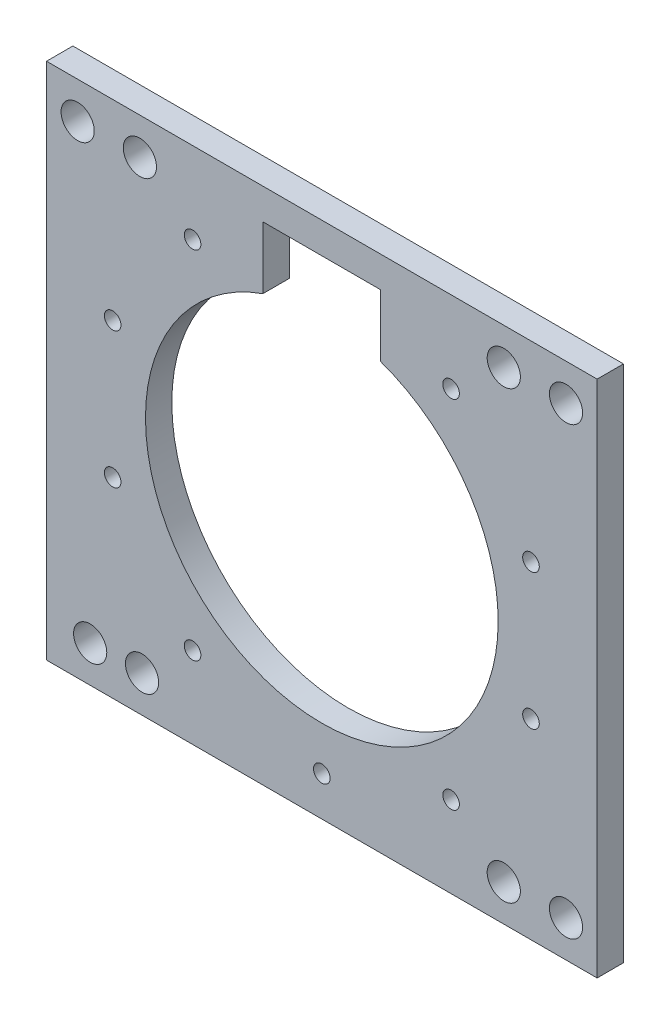
ISO-10303-21;
HEADER;
FILE_DESCRIPTION(('STEP AP214'),'2;1');
FILE_NAME('part.step','',(''),(''),'','','');
FILE_SCHEMA(('AUTOMOTIVE_DESIGN { 1 0 10303 214 1 1 1 1 }'));
ENDSEC;
DATA;
#1=APPLICATION_CONTEXT('core data for automotive mechanical design processes');
#2=APPLICATION_PROTOCOL_DEFINITION('international standard','automotive_design',2000,#1);
#3=PRODUCT_CONTEXT('',#1,'mechanical');
#4=PRODUCT('Part','Part','',(#3));
#5=PRODUCT_RELATED_PRODUCT_CATEGORY('part','',(#4));
#6=PRODUCT_DEFINITION_FORMATION('','',#4);
#7=PRODUCT_DEFINITION_CONTEXT('part definition',#1,'design');
#8=PRODUCT_DEFINITION('design','',#6,#7);
#9=PRODUCT_DEFINITION_SHAPE('','',#8);
#10=(LENGTH_UNIT() NAMED_UNIT(*) SI_UNIT(.MILLI.,.METRE.));
#11=(NAMED_UNIT(*) PLANE_ANGLE_UNIT() SI_UNIT($,.RADIAN.));
#12=(NAMED_UNIT(*) SI_UNIT($,.STERADIAN.) SOLID_ANGLE_UNIT());
#13=UNCERTAINTY_MEASURE_WITH_UNIT(LENGTH_MEASURE(1.E-05),#10,'distance_accuracy_value','');
#14=(GEOMETRIC_REPRESENTATION_CONTEXT(3) GLOBAL_UNCERTAINTY_ASSIGNED_CONTEXT((#13)) GLOBAL_UNIT_ASSIGNED_CONTEXT((#10,
#11,#12)) REPRESENTATION_CONTEXT('',''));
#15=CARTESIAN_POINT('',(0.,0.,0.));
#16=DIRECTION('',(0.,0.,1.));
#17=DIRECTION('',(1.,0.,0.));
#18=AXIS2_PLACEMENT_3D('',#15,#16,#17);
#19=CARTESIAN_POINT('',(0.,0.,6.35));
#20=DIRECTION('',(0.,0.,-1.));
#21=DIRECTION('',(-1.,0.,0.));
#22=AXIS2_PLACEMENT_3D('',#19,#20,#21);
#23=PLANE('',#22);
#24=CARTESIAN_POINT('',(-58.9257107133858,53.3846571464963,6.35));
#25=DIRECTION('',(0.,0.,1.));
#26=DIRECTION('',(1.,0.,0.));
#27=AXIS2_PLACEMENT_3D('',#24,#25,#26);
#28=CIRCLE('',#27,3.99999999999999);
#29=CARTESIAN_POINT('',(-54.9257107133858,53.3846571464963,6.35));
#30=VERTEX_POINT('',#29);
#31=EDGE_CURVE('E306',#30,#30,#28,.T.);
#32=ORIENTED_EDGE('',*,*,#31,.F.);
#33=EDGE_LOOP('',(#32));
#34=FACE_BOUND('',#33,.T.);
#35=CARTESIAN_POINT('',(-43.4033213928974,-53.9903428534907,6.35));
#36=DIRECTION('',(0.,0.,1.));
#37=DIRECTION('',(1.,0.,0.));
#38=AXIS2_PLACEMENT_3D('',#35,#36,#37);
#39=CIRCLE('',#38,3.99999999999999);
#40=CARTESIAN_POINT('',(-39.4033213928974,-53.9903428534907,6.35));
#41=VERTEX_POINT('',#40);
#42=EDGE_CURVE('E301',#41,#41,#39,.T.);
#43=ORIENTED_EDGE('',*,*,#42,.F.);
#44=EDGE_LOOP('',(#43));
#45=FACE_BOUND('',#44,.T.);
#46=CARTESIAN_POINT('',(-55.9033213928974,-53.9903428534907,6.35));
#47=DIRECTION('',(0.,0.,1.));
#48=DIRECTION('',(1.,0.,0.));
#49=AXIS2_PLACEMENT_3D('',#46,#47,#48);
#50=CIRCLE('',#49,3.99999999999999);
#51=CARTESIAN_POINT('',(-51.9033213928974,-53.9903428534907,6.35));
#52=VERTEX_POINT('',#51);
#53=EDGE_CURVE('E294',#52,#52,#50,.T.);
#54=ORIENTED_EDGE('',*,*,#53,.F.);
#55=EDGE_LOOP('',(#54));
#56=FACE_BOUND('',#55,.T.);
#57=CARTESIAN_POINT('',(43.7742892866382,-53.9903428535038,6.35));
#58=DIRECTION('',(0.,0.,1.));
#59=DIRECTION('',(1.,0.,0.));
#60=AXIS2_PLACEMENT_3D('',#57,#58,#59);
#61=CIRCLE('',#60,4.00000000000002);
#62=CARTESIAN_POINT('',(47.7742892866383,-53.9903428535038,6.35));
#63=VERTEX_POINT('',#62);
#64=EDGE_CURVE('E293',#63,#63,#61,.T.);
#65=ORIENTED_EDGE('',*,*,#64,.F.);
#66=EDGE_LOOP('',(#65));
#67=FACE_BOUND('',#66,.T.);
#68=CARTESIAN_POINT('',(-43.9257107133857,53.3846571464963,6.35));
#69=DIRECTION('',(0.,0.,1.));
#70=DIRECTION('',(1.,0.,0.));
#71=AXIS2_PLACEMENT_3D('',#68,#69,#70);
#72=CIRCLE('',#71,3.99999999999999);
#73=CARTESIAN_POINT('',(-39.9257107133858,53.3846571464963,6.35));
#74=VERTEX_POINT('',#73);
#75=EDGE_CURVE('E313',#74,#74,#72,.T.);
#76=ORIENTED_EDGE('',*,*,#75,.F.);
#77=EDGE_LOOP('',(#76));
#78=FACE_BOUND('',#77,.T.);
#79=CARTESIAN_POINT('',(43.7742892866405,53.3846571465095,6.35));
#80=DIRECTION('',(0.,0.,1.));
#81=DIRECTION('',(1.,0.,0.));
#82=AXIS2_PLACEMENT_3D('',#79,#80,#81);
#83=CIRCLE('',#82,3.99999999999999);
#84=CARTESIAN_POINT('',(47.7742892866405,53.3846571465095,6.35));
#85=VERTEX_POINT('',#84);
#86=EDGE_CURVE('E325',#85,#85,#83,.T.);
#87=ORIENTED_EDGE('',*,*,#86,.F.);
#88=EDGE_LOOP('',(#87));
#89=FACE_BOUND('',#88,.T.);
#90=CARTESIAN_POINT('',(58.7742892866405,53.3846571465095,6.35));
#91=DIRECTION('',(0.,0.,1.));
#92=DIRECTION('',(1.,0.,0.));
#93=AXIS2_PLACEMENT_3D('',#90,#91,#92);
#94=CIRCLE('',#93,3.99999999999999);
#95=CARTESIAN_POINT('',(62.7742892866405,53.3846571465095,6.35));
#96=VERTEX_POINT('',#95);
#97=EDGE_CURVE('E318',#96,#96,#94,.T.);
#98=ORIENTED_EDGE('',*,*,#97,.F.);
#99=EDGE_LOOP('',(#98));
#100=FACE_BOUND('',#99,.T.);
#101=CARTESIAN_POINT('',(58.7742892866383,-53.9903428535038,6.35));
#102=DIRECTION('',(0.,0.,1.));
#103=DIRECTION('',(1.,0.,0.));
#104=AXIS2_PLACEMENT_3D('',#101,#102,#103);
#105=CIRCLE('',#104,3.99999999999999);
#106=CARTESIAN_POINT('',(62.7742892866382,-53.9903428535038,6.35));
#107=VERTEX_POINT('',#106);
#108=EDGE_CURVE('E290',#107,#107,#105,.T.);
#109=ORIENTED_EDGE('',*,*,#108,.F.);
#110=EDGE_LOOP('',(#109));
#111=FACE_BOUND('',#110,.T.);
#112=DIRECTION('',(0.,1.,0.));
#113=VECTOR('',#112,1.);
#114=CARTESIAN_POINT('',(66.2742892866405,-62.8028428534907,6.35));
#115=LINE('',#114,#113);
#116=CARTESIAN_POINT('',(66.2742892866405,-62.8028428534907,6.35));
#117=VERTEX_POINT('',#116);
#118=CARTESIAN_POINT('',(66.2742892866405,62.1971571465094,6.35));
#119=VERTEX_POINT('',#118);
#120=EDGE_CURVE('E140',#117,#119,#115,.T.);
#121=ORIENTED_EDGE('',*,*,#120,.T.);
#122=DIRECTION('',(-1.,0.,0.));
#123=VECTOR('',#122,1.);
#124=CARTESIAN_POINT('',(-66.4257107133857,62.1971571465094,6.35));
#125=LINE('',#124,#123);
#126=CARTESIAN_POINT('',(-66.4257107133857,62.1971571465094,6.35));
#127=VERTEX_POINT('',#126);
#128=EDGE_CURVE('E143',#119,#127,#125,.T.);
#129=ORIENTED_EDGE('',*,*,#128,.T.);
#130=DIRECTION('',(0.,-1.,0.));
#131=VECTOR('',#130,1.);
#132=CARTESIAN_POINT('',(-66.4257107133857,-62.8028428534907,6.35));
#133=LINE('',#132,#131);
#134=CARTESIAN_POINT('',(-66.4257107133857,-62.8028428534907,6.35));
#135=VERTEX_POINT('',#134);
#136=EDGE_CURVE('E146',#127,#135,#133,.T.);
#137=ORIENTED_EDGE('',*,*,#136,.T.);
#138=DIRECTION('',(1.,0.,0.));
#139=VECTOR('',#138,1.);
#140=CARTESIAN_POINT('',(-66.4257107133857,-62.8028428534907,6.35));
#141=LINE('',#140,#139);
#142=EDGE_CURVE('E148',#135,#117,#141,.T.);
#143=ORIENTED_EDGE('',*,*,#142,.T.);
#144=EDGE_LOOP('',(#121,#129,#137,#143));
#145=FACE_BOUND('',#144,.T.);
#146=CARTESIAN_POINT('',(-0.0757107133809026,-0.302842853497107,6.34999999999999));
#147=DIRECTION('',(0.,0.,-1.));
#148=DIRECTION('',(-1.,0.,0.));
#149=AXIS2_PLACEMENT_3D('',#146,#147,#148);
#150=CIRCLE('',#149,42.5);
#151=CARTESIAN_POINT('',(14.1242892866191,39.7547406981851,6.35));
#152=VERTEX_POINT('',#151);
#153=CARTESIAN_POINT('',(-14.2757107133809,39.7547406981851,6.34999999999999));
#154=VERTEX_POINT('',#153);
#155=EDGE_CURVE('E136',#152,#154,#150,.T.);
#156=ORIENTED_EDGE('',*,*,#155,.T.);
#157=DIRECTION('',(0.,1.,0.));
#158=VECTOR('',#157,1.);
#159=CARTESIAN_POINT('',(-14.2757107133809,39.7547406981851,6.34999999999999));
#160=LINE('',#159,#158);
#161=CARTESIAN_POINT('',(-14.2757107133809,54.7547406981851,6.34999999999999));
#162=VERTEX_POINT('',#161);
#163=EDGE_CURVE('E139',#154,#162,#160,.T.);
#164=ORIENTED_EDGE('',*,*,#163,.T.);
#165=DIRECTION('',(1.,0.,0.));
#166=VECTOR('',#165,1.);
#167=CARTESIAN_POINT('',(-14.2757107133809,54.7547406981851,6.34999999999999));
#168=LINE('',#167,#166);
#169=CARTESIAN_POINT('',(14.1242892866191,54.7547406981851,6.34999999999999));
#170=VERTEX_POINT('',#169);
#171=EDGE_CURVE('E108',#162,#170,#168,.T.);
#172=ORIENTED_EDGE('',*,*,#171,.T.);
#173=DIRECTION('',(0.,-1.,0.));
#174=VECTOR('',#173,1.);
#175=CARTESIAN_POINT('',(14.1242892866191,54.7547406981851,6.34999999999999));
#176=LINE('',#175,#174);
#177=EDGE_CURVE('E155',#170,#152,#176,.T.);
#178=ORIENTED_EDGE('',*,*,#177,.T.);
#179=EDGE_LOOP('',(#156,#164,#172,#178));
#180=FACE_BOUND('',#179,.T.);
#181=CARTESIAN_POINT('',(-31.228329084882,42.5750578483751,6.34999999999999));
#182=DIRECTION('',(0.,0.,-1.));
#183=DIRECTION('',(-1.,0.,0.));
#184=AXIS2_PLACEMENT_3D('',#181,#182,#183);
#185=CIRCLE('',#184,2.00000000000008);
#186=CARTESIAN_POINT('',(-33.2283290848821,42.5750578483751,6.34999999999999));
#187=VERTEX_POINT('',#186);
#188=EDGE_CURVE('E284',#187,#187,#185,.T.);
#189=ORIENTED_EDGE('',*,*,#188,.T.);
#190=EDGE_LOOP('',(#189));
#191=FACE_BOUND('',#190,.T.);
#192=CARTESIAN_POINT('',(31.0769076581202,42.5750578483751,6.34999999999999));
#193=DIRECTION('',(0.,0.,-1.));
#194=DIRECTION('',(-1.,0.,0.));
#195=AXIS2_PLACEMENT_3D('',#192,#193,#194);
#196=CIRCLE('',#195,2.00000000000068);
#197=CARTESIAN_POINT('',(29.0769076581195,42.5750578483751,6.34999999999999));
#198=VERTEX_POINT('',#197);
#199=EDGE_CURVE('E238',#198,#198,#196,.T.);
#200=ORIENTED_EDGE('',*,*,#199,.T.);
#201=EDGE_LOOP('',(#200));
#202=FACE_BOUND('',#201,.T.);
#203=CARTESIAN_POINT('',(50.3302846502623,16.0750578483751,6.34999999999999));
#204=DIRECTION('',(0.,0.,-1.));
#205=DIRECTION('',(-1.,0.,0.));
#206=AXIS2_PLACEMENT_3D('',#203,#204,#205);
#207=CIRCLE('',#206,2.0000000000006);
#208=CARTESIAN_POINT('',(48.3302846502616,16.0750578483751,6.34999999999999));
#209=VERTEX_POINT('',#208);
#210=EDGE_CURVE('E237',#209,#209,#207,.T.);
#211=ORIENTED_EDGE('',*,*,#210,.T.);
#212=EDGE_LOOP('',(#211));
#213=FACE_BOUND('',#212,.T.);
#214=CARTESIAN_POINT('',(50.3302846502623,-16.6807435553693,6.34999999999999));
#215=DIRECTION('',(0.,0.,-1.));
#216=DIRECTION('',(-1.,0.,0.));
#217=AXIS2_PLACEMENT_3D('',#214,#215,#216);
#218=CIRCLE('',#217,2.00000000000049);
#219=CARTESIAN_POINT('',(48.3302846502618,-16.6807435553693,6.34999999999999));
#220=VERTEX_POINT('',#219);
#221=EDGE_CURVE('E245',#220,#220,#218,.T.);
#222=ORIENTED_EDGE('',*,*,#221,.T.);
#223=EDGE_LOOP('',(#222));
#224=FACE_BOUND('',#223,.T.);
#225=CARTESIAN_POINT('',(31.0769076581202,-43.1807435553694,6.34999999999999));
#226=DIRECTION('',(0.,0.,-1.));
#227=DIRECTION('',(-1.,0.,0.));
#228=AXIS2_PLACEMENT_3D('',#225,#226,#227);
#229=CIRCLE('',#228,2.00000000000045);
#230=CARTESIAN_POINT('',(29.0769076581197,-43.1807435553694,6.34999999999999));
#231=VERTEX_POINT('',#230);
#232=EDGE_CURVE('E251',#231,#231,#229,.T.);
#233=ORIENTED_EDGE('',*,*,#232,.T.);
#234=EDGE_LOOP('',(#233));
#235=FACE_BOUND('',#234,.T.);
#236=CARTESIAN_POINT('',(-0.0757107133809061,-53.3028428534971,6.34999999999999));
#237=DIRECTION('',(0.,0.,-1.));
#238=DIRECTION('',(-1.,0.,0.));
#239=AXIS2_PLACEMENT_3D('',#236,#237,#238);
#240=CIRCLE('',#239,2.00000000000036);
#241=CARTESIAN_POINT('',(-2.07571071338126,-53.3028428534971,6.34999999999999));
#242=VERTEX_POINT('',#241);
#243=EDGE_CURVE('E257',#242,#242,#240,.T.);
#244=ORIENTED_EDGE('',*,*,#243,.T.);
#245=EDGE_LOOP('',(#244));
#246=FACE_BOUND('',#245,.T.);
#247=CARTESIAN_POINT('',(-31.228329084882,-43.1807435553693,6.34999999999999));
#248=DIRECTION('',(0.,0.,-1.));
#249=DIRECTION('',(-1.,0.,0.));
#250=AXIS2_PLACEMENT_3D('',#247,#248,#249);
#251=CIRCLE('',#250,2.00000000000028);
#252=CARTESIAN_POINT('',(-33.2283290848823,-43.1807435553693,6.34999999999999));
#253=VERTEX_POINT('',#252);
#254=EDGE_CURVE('E263',#253,#253,#251,.T.);
#255=ORIENTED_EDGE('',*,*,#254,.T.);
#256=EDGE_LOOP('',(#255));
#257=FACE_BOUND('',#256,.T.);
#258=CARTESIAN_POINT('',(-50.4817060770241,-16.6807435553693,6.34999999999999));
#259=DIRECTION('',(0.,0.,-1.));
#260=DIRECTION('',(-1.,0.,0.));
#261=AXIS2_PLACEMENT_3D('',#258,#259,#260);
#262=CIRCLE('',#261,2.00000000000021);
#263=CARTESIAN_POINT('',(-52.4817060770243,-16.6807435553693,6.34999999999999));
#264=VERTEX_POINT('',#263);
#265=EDGE_CURVE('E269',#264,#264,#262,.T.);
#266=ORIENTED_EDGE('',*,*,#265,.T.);
#267=EDGE_LOOP('',(#266));
#268=FACE_BOUND('',#267,.T.);
#269=CARTESIAN_POINT('',(-50.4817060770241,16.0750578483751,6.34999999999999));
#270=DIRECTION('',(0.,0.,-1.));
#271=DIRECTION('',(-1.,0.,0.));
#272=AXIS2_PLACEMENT_3D('',#269,#270,#271);
#273=CIRCLE('',#272,2.00000000000015);
#274=CARTESIAN_POINT('',(-52.4817060770242,16.0750578483751,6.34999999999999));
#275=VERTEX_POINT('',#274);
#276=EDGE_CURVE('E275',#275,#275,#273,.T.);
#277=ORIENTED_EDGE('',*,*,#276,.T.);
#278=EDGE_LOOP('',(#277));
#279=FACE_BOUND('',#278,.T.);
#280=ADVANCED_FACE('F40',(#34,#45,#56,#67,#78,#89,#100,#111,#145,#180,#191,#202,#213,#224,#235,
#246,#257,#268,#279),#23,.F.);
#281=CARTESIAN_POINT('',(0.,0.,0.));
#282=DIRECTION('',(0.,0.,-1.));
#283=DIRECTION('',(-1.,0.,0.));
#284=AXIS2_PLACEMENT_3D('',#281,#282,#283);
#285=PLANE('',#284);
#286=CARTESIAN_POINT('',(-58.9257107133858,53.3846571464963,0.));
#287=DIRECTION('',(0.,0.,-1.));
#288=DIRECTION('',(-1.,0.,0.));
#289=AXIS2_PLACEMENT_3D('',#286,#287,#288);
#290=CIRCLE('',#289,3.99999999999999);
#291=CARTESIAN_POINT('',(-62.9257107133857,53.3846571464963,0.));
#292=VERTEX_POINT('',#291);
#293=EDGE_CURVE('E310',#292,#292,#290,.F.);
#294=ORIENTED_EDGE('',*,*,#293,.T.);
#295=EDGE_LOOP('',(#294));
#296=FACE_BOUND('',#295,.T.);
#297=CARTESIAN_POINT('',(-43.4033213928974,-53.9903428534907,0.));
#298=DIRECTION('',(0.,0.,-1.));
#299=DIRECTION('',(-1.,0.,0.));
#300=AXIS2_PLACEMENT_3D('',#297,#298,#299);
#301=CIRCLE('',#300,3.99999999999999);
#302=CARTESIAN_POINT('',(-47.4033213928974,-53.9903428534907,0.));
#303=VERTEX_POINT('',#302);
#304=EDGE_CURVE('E309',#303,#303,#301,.F.);
#305=ORIENTED_EDGE('',*,*,#304,.T.);
#306=EDGE_LOOP('',(#305));
#307=FACE_BOUND('',#306,.T.);
#308=CARTESIAN_POINT('',(-55.9033213928974,-53.9903428534907,0.));
#309=DIRECTION('',(0.,0.,-1.));
#310=DIRECTION('',(-1.,0.,0.));
#311=AXIS2_PLACEMENT_3D('',#308,#309,#310);
#312=CIRCLE('',#311,3.99999999999999);
#313=CARTESIAN_POINT('',(-59.9033213928974,-53.9903428534907,0.));
#314=VERTEX_POINT('',#313);
#315=EDGE_CURVE('E298',#314,#314,#312,.F.);
#316=ORIENTED_EDGE('',*,*,#315,.T.);
#317=EDGE_LOOP('',(#316));
#318=FACE_BOUND('',#317,.T.);
#319=CARTESIAN_POINT('',(43.7742892866382,-53.9903428535038,0.));
#320=DIRECTION('',(0.,0.,-1.));
#321=DIRECTION('',(-1.,0.,0.));
#322=AXIS2_PLACEMENT_3D('',#319,#320,#321);
#323=CIRCLE('',#322,4.00000000000002);
#324=CARTESIAN_POINT('',(39.7742892866382,-53.9903428535038,0.));
#325=VERTEX_POINT('',#324);
#326=EDGE_CURVE('E297',#325,#325,#323,.F.);
#327=ORIENTED_EDGE('',*,*,#326,.T.);
#328=EDGE_LOOP('',(#327));
#329=FACE_BOUND('',#328,.T.);
#330=CARTESIAN_POINT('',(-43.9257107133857,53.3846571464963,0.));
#331=DIRECTION('',(0.,0.,-1.));
#332=DIRECTION('',(-1.,0.,0.));
#333=AXIS2_PLACEMENT_3D('',#330,#331,#332);
#334=CIRCLE('',#333,3.99999999999999);
#335=CARTESIAN_POINT('',(-47.9257107133857,53.3846571464963,0.));
#336=VERTEX_POINT('',#335);
#337=EDGE_CURVE('E328',#336,#336,#334,.F.);
#338=ORIENTED_EDGE('',*,*,#337,.T.);
#339=EDGE_LOOP('',(#338));
#340=FACE_BOUND('',#339,.T.);
#341=CARTESIAN_POINT('',(43.7742892866405,53.3846571465095,0.));
#342=DIRECTION('',(0.,0.,-1.));
#343=DIRECTION('',(-1.,0.,0.));
#344=AXIS2_PLACEMENT_3D('',#341,#342,#343);
#345=CIRCLE('',#344,3.99999999999999);
#346=CARTESIAN_POINT('',(39.7742892866405,53.3846571465095,0.));
#347=VERTEX_POINT('',#346);
#348=EDGE_CURVE('E321',#347,#347,#345,.F.);
#349=ORIENTED_EDGE('',*,*,#348,.T.);
#350=EDGE_LOOP('',(#349));
#351=FACE_BOUND('',#350,.T.);
#352=CARTESIAN_POINT('',(58.7742892866405,53.3846571465095,0.));
#353=DIRECTION('',(0.,0.,-1.));
#354=DIRECTION('',(-1.,0.,0.));
#355=AXIS2_PLACEMENT_3D('',#352,#353,#354);
#356=CIRCLE('',#355,3.99999999999999);
#357=CARTESIAN_POINT('',(54.7742892866405,53.3846571465095,0.));
#358=VERTEX_POINT('',#357);
#359=EDGE_CURVE('E322',#358,#358,#356,.F.);
#360=ORIENTED_EDGE('',*,*,#359,.T.);
#361=EDGE_LOOP('',(#360));
#362=FACE_BOUND('',#361,.T.);
#363=CARTESIAN_POINT('',(58.7742892866383,-53.9903428535038,0.));
#364=DIRECTION('',(0.,0.,-1.));
#365=DIRECTION('',(-1.,0.,0.));
#366=AXIS2_PLACEMENT_3D('',#363,#364,#365);
#367=CIRCLE('',#366,3.99999999999999);
#368=CARTESIAN_POINT('',(54.7742892866383,-53.9903428535038,0.));
#369=VERTEX_POINT('',#368);
#370=EDGE_CURVE('E287',#369,#369,#367,.F.);
#371=ORIENTED_EDGE('',*,*,#370,.T.);
#372=EDGE_LOOP('',(#371));
#373=FACE_BOUND('',#372,.T.);
#374=CARTESIAN_POINT('',(-50.4817060770241,-16.6807435553693,0.));
#375=DIRECTION('',(0.,0.,1.));
#376=DIRECTION('',(1.,0.,0.));
#377=AXIS2_PLACEMENT_3D('',#374,#375,#376);
#378=CIRCLE('',#377,2.00000000000021);
#379=CARTESIAN_POINT('',(-48.4817060770238,-16.6807435553693,0.));
#380=VERTEX_POINT('',#379);
#381=EDGE_CURVE('E272',#380,#380,#378,.T.);
#382=ORIENTED_EDGE('',*,*,#381,.T.);
#383=EDGE_LOOP('',(#382));
#384=FACE_BOUND('',#383,.T.);
#385=CARTESIAN_POINT('',(-0.0757107133809061,-53.3028428534971,0.));
#386=DIRECTION('',(0.,0.,1.));
#387=DIRECTION('',(1.,0.,0.));
#388=AXIS2_PLACEMENT_3D('',#385,#386,#387);
#389=CIRCLE('',#388,2.00000000000036);
#390=CARTESIAN_POINT('',(1.92428928661945,-53.3028428534971,0.));
#391=VERTEX_POINT('',#390);
#392=EDGE_CURVE('E260',#391,#391,#389,.T.);
#393=ORIENTED_EDGE('',*,*,#392,.T.);
#394=EDGE_LOOP('',(#393));
#395=FACE_BOUND('',#394,.T.);
#396=CARTESIAN_POINT('',(50.3302846502623,-16.6807435553693,0.));
#397=DIRECTION('',(0.,0.,1.));
#398=DIRECTION('',(1.,0.,0.));
#399=AXIS2_PLACEMENT_3D('',#396,#397,#398);
#400=CIRCLE('',#399,2.00000000000049);
#401=CARTESIAN_POINT('',(52.3302846502627,-16.6807435553693,0.));
#402=VERTEX_POINT('',#401);
#403=EDGE_CURVE('E248',#402,#402,#400,.T.);
#404=ORIENTED_EDGE('',*,*,#403,.T.);
#405=EDGE_LOOP('',(#404));
#406=FACE_BOUND('',#405,.T.);
#407=CARTESIAN_POINT('',(31.0769076581202,42.5750578483751,0.));
#408=DIRECTION('',(0.,0.,1.));
#409=DIRECTION('',(1.,0.,0.));
#410=AXIS2_PLACEMENT_3D('',#407,#408,#409);
#411=CIRCLE('',#410,2.00000000000068);
#412=CARTESIAN_POINT('',(33.0769076581209,42.5750578483751,0.));
#413=VERTEX_POINT('',#412);
#414=EDGE_CURVE('E234',#413,#413,#411,.T.);
#415=ORIENTED_EDGE('',*,*,#414,.T.);
#416=EDGE_LOOP('',(#415));
#417=FACE_BOUND('',#416,.T.);
#418=DIRECTION('',(0.,-1.,0.));
#419=VECTOR('',#418,1.);
#420=CARTESIAN_POINT('',(-14.2757107133809,39.7547406981851,0.));
#421=LINE('',#420,#419);
#422=CARTESIAN_POINT('',(-14.2757107133809,54.7547406981851,0.));
#423=VERTEX_POINT('',#422);
#424=CARTESIAN_POINT('',(-14.2757107133809,39.7547406981851,0.));
#425=VERTEX_POINT('',#424);
#426=EDGE_CURVE('E115',#423,#425,#421,.T.);
#427=ORIENTED_EDGE('',*,*,#426,.T.);
#428=CARTESIAN_POINT('',(-0.0757107133809026,-0.302842853497107,0.));
#429=DIRECTION('',(0.,0.,1.));
#430=DIRECTION('',(1.,0.,0.));
#431=AXIS2_PLACEMENT_3D('',#428,#429,#430);
#432=CIRCLE('',#431,42.5);
#433=CARTESIAN_POINT('',(14.1242892866191,39.7547406981851,0.));
#434=VERTEX_POINT('',#433);
#435=EDGE_CURVE('E121',#425,#434,#432,.T.);
#436=ORIENTED_EDGE('',*,*,#435,.T.);
#437=DIRECTION('',(0.,1.,0.));
#438=VECTOR('',#437,1.);
#439=CARTESIAN_POINT('',(14.1242892866191,54.7547406981851,0.));
#440=LINE('',#439,#438);
#441=CARTESIAN_POINT('',(14.1242892866191,54.7547406981851,0.));
#442=VERTEX_POINT('',#441);
#443=EDGE_CURVE('E126',#434,#442,#440,.T.);
#444=ORIENTED_EDGE('',*,*,#443,.T.);
#445=DIRECTION('',(-1.,0.,0.));
#446=VECTOR('',#445,1.);
#447=CARTESIAN_POINT('',(-14.2757107133809,54.7547406981851,0.));
#448=LINE('',#447,#446);
#449=EDGE_CURVE('E63',#442,#423,#448,.T.);
#450=ORIENTED_EDGE('',*,*,#449,.T.);
#451=EDGE_LOOP('',(#427,#436,#444,#450));
#452=FACE_BOUND('',#451,.T.);
#453=DIRECTION('',(0.,1.,0.));
#454=VECTOR('',#453,1.);
#455=CARTESIAN_POINT('',(66.2742892866405,-62.8028428534907,0.));
#456=LINE('',#455,#454);
#457=CARTESIAN_POINT('',(66.2742892866405,-62.8028428534907,0.));
#458=VERTEX_POINT('',#457);
#459=CARTESIAN_POINT('',(66.2742892866405,62.1971571465094,0.));
#460=VERTEX_POINT('',#459);
#461=EDGE_CURVE('E151',#458,#460,#456,.T.);
#462=ORIENTED_EDGE('',*,*,#461,.F.);
#463=DIRECTION('',(1.,0.,0.));
#464=VECTOR('',#463,1.);
#465=CARTESIAN_POINT('',(-66.4257107133857,-62.8028428534907,0.));
#466=LINE('',#465,#464);
#467=CARTESIAN_POINT('',(-66.4257107133857,-62.8028428534907,0.));
#468=VERTEX_POINT('',#467);
#469=EDGE_CURVE('E144',#468,#458,#466,.T.);
#470=ORIENTED_EDGE('',*,*,#469,.F.);
#471=DIRECTION('',(0.,-1.,0.));
#472=VECTOR('',#471,1.);
#473=CARTESIAN_POINT('',(-66.4257107133857,-62.8028428534907,0.));
#474=LINE('',#473,#472);
#475=CARTESIAN_POINT('',(-66.4257107133857,62.1971571465094,0.));
#476=VERTEX_POINT('',#475);
#477=EDGE_CURVE('E157',#476,#468,#474,.T.);
#478=ORIENTED_EDGE('',*,*,#477,.F.);
#479=DIRECTION('',(-1.,0.,0.));
#480=VECTOR('',#479,1.);
#481=CARTESIAN_POINT('',(-66.4257107133857,62.1971571465094,0.));
#482=LINE('',#481,#480);
#483=EDGE_CURVE('E154',#460,#476,#482,.T.);
#484=ORIENTED_EDGE('',*,*,#483,.F.);
#485=EDGE_LOOP('',(#462,#470,#478,#484));
#486=FACE_BOUND('',#485,.T.);
#487=CARTESIAN_POINT('',(-31.228329084882,42.5750578483751,0.));
#488=DIRECTION('',(0.,0.,1.));
#489=DIRECTION('',(1.,0.,0.));
#490=AXIS2_PLACEMENT_3D('',#487,#488,#489);
#491=CIRCLE('',#490,2.00000000000008);
#492=CARTESIAN_POINT('',(-29.2283290848819,42.5750578483751,0.));
#493=VERTEX_POINT('',#492);
#494=EDGE_CURVE('E241',#493,#493,#491,.T.);
#495=ORIENTED_EDGE('',*,*,#494,.T.);
#496=EDGE_LOOP('',(#495));
#497=FACE_BOUND('',#496,.T.);
#498=CARTESIAN_POINT('',(50.3302846502623,16.0750578483751,0.));
#499=DIRECTION('',(0.,0.,1.));
#500=DIRECTION('',(1.,0.,0.));
#501=AXIS2_PLACEMENT_3D('',#498,#499,#500);
#502=CIRCLE('',#501,2.0000000000006);
#503=CARTESIAN_POINT('',(52.3302846502629,16.0750578483751,0.));
#504=VERTEX_POINT('',#503);
#505=EDGE_CURVE('E242',#504,#504,#502,.T.);
#506=ORIENTED_EDGE('',*,*,#505,.T.);
#507=EDGE_LOOP('',(#506));
#508=FACE_BOUND('',#507,.T.);
#509=CARTESIAN_POINT('',(31.0769076581202,-43.1807435553694,0.));
#510=DIRECTION('',(0.,0.,1.));
#511=DIRECTION('',(1.,0.,0.));
#512=AXIS2_PLACEMENT_3D('',#509,#510,#511);
#513=CIRCLE('',#512,2.00000000000045);
#514=CARTESIAN_POINT('',(33.0769076581206,-43.1807435553694,0.));
#515=VERTEX_POINT('',#514);
#516=EDGE_CURVE('E254',#515,#515,#513,.T.);
#517=ORIENTED_EDGE('',*,*,#516,.T.);
#518=EDGE_LOOP('',(#517));
#519=FACE_BOUND('',#518,.T.);
#520=CARTESIAN_POINT('',(-31.228329084882,-43.1807435553693,0.));
#521=DIRECTION('',(0.,0.,1.));
#522=DIRECTION('',(1.,0.,0.));
#523=AXIS2_PLACEMENT_3D('',#520,#521,#522);
#524=CIRCLE('',#523,2.00000000000028);
#525=CARTESIAN_POINT('',(-29.2283290848817,-43.1807435553693,0.));
#526=VERTEX_POINT('',#525);
#527=EDGE_CURVE('E266',#526,#526,#524,.T.);
#528=ORIENTED_EDGE('',*,*,#527,.T.);
#529=EDGE_LOOP('',(#528));
#530=FACE_BOUND('',#529,.T.);
#531=CARTESIAN_POINT('',(-50.4817060770241,16.0750578483751,0.));
#532=DIRECTION('',(0.,0.,1.));
#533=DIRECTION('',(1.,0.,0.));
#534=AXIS2_PLACEMENT_3D('',#531,#532,#533);
#535=CIRCLE('',#534,2.00000000000015);
#536=CARTESIAN_POINT('',(-48.4817060770239,16.0750578483751,0.));
#537=VERTEX_POINT('',#536);
#538=EDGE_CURVE('E128',#537,#537,#535,.T.);
#539=ORIENTED_EDGE('',*,*,#538,.T.);
#540=EDGE_LOOP('',(#539));
#541=FACE_BOUND('',#540,.T.);
#542=ADVANCED_FACE('F124',(#296,#307,#318,#329,#340,#351,#362,#373,#384,#395,#406,#417,#452,
#486,#497,#508,#519,#530,#541),#285,.T.);
#543=CARTESIAN_POINT('',(66.2742892866405,-62.8028428534907,6.35));
#544=DIRECTION('',(-1.,0.,0.));
#545=DIRECTION('',(0.,0.,1.));
#546=AXIS2_PLACEMENT_3D('',#543,#544,#545);
#547=PLANE('',#546);
#548=ORIENTED_EDGE('',*,*,#461,.T.);
#549=DIRECTION('',(0.,0.,-1.));
#550=VECTOR('',#549,1.);
#551=CARTESIAN_POINT('',(66.2742892866405,62.1971571465094,6.35));
#552=LINE('',#551,#550);
#553=EDGE_CURVE('E11',#119,#460,#552,.T.);
#554=ORIENTED_EDGE('',*,*,#553,.F.);
#555=ORIENTED_EDGE('',*,*,#120,.F.);
#556=DIRECTION('',(0.,0.,-1.));
#557=VECTOR('',#556,1.);
#558=CARTESIAN_POINT('',(66.2742892866405,-62.8028428534907,6.35));
#559=LINE('',#558,#557);
#560=EDGE_CURVE('E150',#117,#458,#559,.T.);
#561=ORIENTED_EDGE('',*,*,#560,.T.);
#562=EDGE_LOOP('',(#548,#554,#555,#561));
#563=FACE_BOUND('',#562,.T.);
#564=ADVANCED_FACE('F42',(#563),#547,.F.);
#565=CARTESIAN_POINT('',(-66.4257107133857,62.1971571465094,6.35));
#566=DIRECTION('',(0.,-1.,0.));
#567=DIRECTION('',(1.,0.,0.));
#568=AXIS2_PLACEMENT_3D('',#565,#566,#567);
#569=PLANE('',#568);
#570=ORIENTED_EDGE('',*,*,#483,.T.);
#571=DIRECTION('',(0.,0.,-1.));
#572=VECTOR('',#571,1.);
#573=CARTESIAN_POINT('',(-66.4257107133857,62.1971571465094,6.35));
#574=LINE('',#573,#572);
#575=EDGE_CURVE('E48',#127,#476,#574,.T.);
#576=ORIENTED_EDGE('',*,*,#575,.F.);
#577=ORIENTED_EDGE('',*,*,#128,.F.);
#578=ORIENTED_EDGE('',*,*,#553,.T.);
#579=EDGE_LOOP('',(#570,#576,#577,#578));
#580=FACE_BOUND('',#579,.T.);
#581=ADVANCED_FACE('F184',(#580),#569,.F.);
#582=CARTESIAN_POINT('',(-66.4257107133857,-62.8028428534907,6.35));
#583=DIRECTION('',(1.,0.,0.));
#584=DIRECTION('',(0.,0.,-1.));
#585=AXIS2_PLACEMENT_3D('',#582,#583,#584);
#586=PLANE('',#585);
#587=ORIENTED_EDGE('',*,*,#477,.T.);
#588=DIRECTION('',(0.,0.,-1.));
#589=VECTOR('',#588,1.);
#590=CARTESIAN_POINT('',(-66.4257107133857,-62.8028428534907,6.35));
#591=LINE('',#590,#589);
#592=EDGE_CURVE('E162',#135,#468,#591,.T.);
#593=ORIENTED_EDGE('',*,*,#592,.F.);
#594=ORIENTED_EDGE('',*,*,#136,.F.);
#595=ORIENTED_EDGE('',*,*,#575,.T.);
#596=EDGE_LOOP('',(#587,#593,#594,#595));
#597=FACE_BOUND('',#596,.T.);
#598=ADVANCED_FACE('F169',(#597),#586,.F.);
#599=CARTESIAN_POINT('',(-66.4257107133857,-62.8028428534907,6.35));
#600=DIRECTION('',(0.,1.,0.));
#601=DIRECTION('',(0.,0.,1.));
#602=AXIS2_PLACEMENT_3D('',#599,#600,#601);
#603=PLANE('',#602);
#604=ORIENTED_EDGE('',*,*,#469,.T.);
#605=ORIENTED_EDGE('',*,*,#560,.F.);
#606=ORIENTED_EDGE('',*,*,#142,.F.);
#607=ORIENTED_EDGE('',*,*,#592,.T.);
#608=EDGE_LOOP('',(#604,#605,#606,#607));
#609=FACE_BOUND('',#608,.T.);
#610=ADVANCED_FACE('F177',(#609),#603,.F.);
#611=CARTESIAN_POINT('',(-0.0757107133809026,-0.302842853497107,135.742743646788));
#612=DIRECTION('',(0.,0.,-1.));
#613=DIRECTION('',(-1.,0.,0.));
#614=AXIS2_PLACEMENT_3D('',#611,#612,#613);
#615=CYLINDRICAL_SURFACE('',#614,42.5);
#616=DIRECTION('',(0.,0.,-1.));
#617=VECTOR('',#616,1.);
#618=CARTESIAN_POINT('',(14.1242892866191,39.7547406981851,135.742743646788));
#619=LINE('',#618,#617);
#620=EDGE_CURVE('E55',#152,#434,#619,.T.);
#621=ORIENTED_EDGE('',*,*,#620,.T.);
#622=ORIENTED_EDGE('',*,*,#435,.F.);
#623=DIRECTION('',(0.,0.,-1.));
#624=VECTOR('',#623,1.);
#625=CARTESIAN_POINT('',(-14.2757107133809,39.7547406981851,135.742743646788));
#626=LINE('',#625,#624);
#627=EDGE_CURVE('E112',#154,#425,#626,.T.);
#628=ORIENTED_EDGE('',*,*,#627,.F.);
#629=ORIENTED_EDGE('',*,*,#155,.F.);
#630=EDGE_LOOP('',(#621,#622,#628,#629));
#631=FACE_BOUND('',#630,.T.);
#632=ADVANCED_FACE('F206',(#631),#615,.F.);
#633=CARTESIAN_POINT('',(-14.2757107133809,39.7547406981851,135.742743646788));
#634=DIRECTION('',(1.,0.,0.));
#635=DIRECTION('',(0.,0.,-1.));
#636=AXIS2_PLACEMENT_3D('',#633,#634,#635);
#637=PLANE('',#636);
#638=ORIENTED_EDGE('',*,*,#627,.T.);
#639=ORIENTED_EDGE('',*,*,#426,.F.);
#640=DIRECTION('',(0.,0.,-1.));
#641=VECTOR('',#640,1.);
#642=CARTESIAN_POINT('',(-14.2757107133809,54.7547406981851,135.742743646788));
#643=LINE('',#642,#641);
#644=EDGE_CURVE('E104',#162,#423,#643,.T.);
#645=ORIENTED_EDGE('',*,*,#644,.F.);
#646=ORIENTED_EDGE('',*,*,#163,.F.);
#647=EDGE_LOOP('',(#638,#639,#645,#646));
#648=FACE_BOUND('',#647,.T.);
#649=ADVANCED_FACE('F116',(#648),#637,.T.);
#650=CARTESIAN_POINT('',(-14.2757107133809,54.7547406981851,135.742743646788));
#651=DIRECTION('',(0.,-1.,0.));
#652=DIRECTION('',(0.,0.,-1.));
#653=AXIS2_PLACEMENT_3D('',#650,#651,#652);
#654=PLANE('',#653);
#655=ORIENTED_EDGE('',*,*,#644,.T.);
#656=ORIENTED_EDGE('',*,*,#449,.F.);
#657=DIRECTION('',(0.,0.,-1.));
#658=VECTOR('',#657,1.);
#659=CARTESIAN_POINT('',(14.1242892866191,54.7547406981851,135.742743646788));
#660=LINE('',#659,#658);
#661=EDGE_CURVE('E111',#170,#442,#660,.T.);
#662=ORIENTED_EDGE('',*,*,#661,.F.);
#663=ORIENTED_EDGE('',*,*,#171,.F.);
#664=EDGE_LOOP('',(#655,#656,#662,#663));
#665=FACE_BOUND('',#664,.T.);
#666=ADVANCED_FACE('F106',(#665),#654,.T.);
#667=CARTESIAN_POINT('',(14.1242892866191,54.7547406981851,135.742743646788));
#668=DIRECTION('',(-1.,0.,0.));
#669=DIRECTION('',(0.,0.,1.));
#670=AXIS2_PLACEMENT_3D('',#667,#668,#669);
#671=PLANE('',#670);
#672=ORIENTED_EDGE('',*,*,#661,.T.);
#673=ORIENTED_EDGE('',*,*,#443,.F.);
#674=ORIENTED_EDGE('',*,*,#620,.F.);
#675=ORIENTED_EDGE('',*,*,#177,.F.);
#676=EDGE_LOOP('',(#672,#673,#674,#675));
#677=FACE_BOUND('',#676,.T.);
#678=ADVANCED_FACE('F202',(#677),#671,.T.);
#679=CARTESIAN_POINT('',(-31.228329084882,42.5750578483751,135.742743646788));
#680=DIRECTION('',(0.,0.,-1.));
#681=DIRECTION('',(-1.,0.,0.));
#682=AXIS2_PLACEMENT_3D('',#679,#680,#681);
#683=CYLINDRICAL_SURFACE('',#682,2.00000000000008);
#684=ORIENTED_EDGE('',*,*,#188,.F.);
#685=EDGE_LOOP('',(#684));
#686=FACE_BOUND('',#685,.T.);
#687=ORIENTED_EDGE('',*,*,#494,.F.);
#688=EDGE_LOOP('',(#687));
#689=FACE_BOUND('',#688,.T.);
#690=ADVANCED_FACE('F223',(#686,#689),#683,.F.);
#691=CARTESIAN_POINT('',(31.0769076581202,42.5750578483751,135.742743646788));
#692=DIRECTION('',(0.,0.,-1.));
#693=DIRECTION('',(-1.,0.,0.));
#694=AXIS2_PLACEMENT_3D('',#691,#692,#693);
#695=CYLINDRICAL_SURFACE('',#694,2.00000000000068);
#696=ORIENTED_EDGE('',*,*,#199,.F.);
#697=EDGE_LOOP('',(#696));
#698=FACE_BOUND('',#697,.T.);
#699=ORIENTED_EDGE('',*,*,#414,.F.);
#700=EDGE_LOOP('',(#699));
#701=FACE_BOUND('',#700,.T.);
#702=ADVANCED_FACE('F217',(#698,#701),#695,.F.);
#703=CARTESIAN_POINT('',(50.3302846502623,16.0750578483751,135.742743646788));
#704=DIRECTION('',(0.,0.,-1.));
#705=DIRECTION('',(-1.,0.,0.));
#706=AXIS2_PLACEMENT_3D('',#703,#704,#705);
#707=CYLINDRICAL_SURFACE('',#706,2.0000000000006);
#708=ORIENTED_EDGE('',*,*,#210,.F.);
#709=EDGE_LOOP('',(#708));
#710=FACE_BOUND('',#709,.T.);
#711=ORIENTED_EDGE('',*,*,#505,.F.);
#712=EDGE_LOOP('',(#711));
#713=FACE_BOUND('',#712,.T.);
#714=ADVANCED_FACE('F395',(#710,#713),#707,.F.);
#715=CARTESIAN_POINT('',(50.3302846502623,-16.6807435553693,135.742743646788));
#716=DIRECTION('',(0.,0.,-1.));
#717=DIRECTION('',(-1.,0.,0.));
#718=AXIS2_PLACEMENT_3D('',#715,#716,#717);
#719=CYLINDRICAL_SURFACE('',#718,2.00000000000049);
#720=ORIENTED_EDGE('',*,*,#221,.F.);
#721=EDGE_LOOP('',(#720));
#722=FACE_BOUND('',#721,.T.);
#723=ORIENTED_EDGE('',*,*,#403,.F.);
#724=EDGE_LOOP('',(#723));
#725=FACE_BOUND('',#724,.T.);
#726=ADVANCED_FACE('F392',(#722,#725),#719,.F.);
#727=CARTESIAN_POINT('',(31.0769076581202,-43.1807435553694,135.742743646788));
#728=DIRECTION('',(0.,0.,-1.));
#729=DIRECTION('',(-1.,0.,0.));
#730=AXIS2_PLACEMENT_3D('',#727,#728,#729);
#731=CYLINDRICAL_SURFACE('',#730,2.00000000000045);
#732=ORIENTED_EDGE('',*,*,#232,.F.);
#733=EDGE_LOOP('',(#732));
#734=FACE_BOUND('',#733,.T.);
#735=ORIENTED_EDGE('',*,*,#516,.F.);
#736=EDGE_LOOP('',(#735));
#737=FACE_BOUND('',#736,.T.);
#738=ADVANCED_FACE('F388',(#734,#737),#731,.F.);
#739=CARTESIAN_POINT('',(-0.0757107133809061,-53.3028428534971,135.742743646788));
#740=DIRECTION('',(0.,0.,-1.));
#741=DIRECTION('',(-1.,0.,0.));
#742=AXIS2_PLACEMENT_3D('',#739,#740,#741);
#743=CYLINDRICAL_SURFACE('',#742,2.00000000000036);
#744=ORIENTED_EDGE('',*,*,#243,.F.);
#745=EDGE_LOOP('',(#744));
#746=FACE_BOUND('',#745,.T.);
#747=ORIENTED_EDGE('',*,*,#392,.F.);
#748=EDGE_LOOP('',(#747));
#749=FACE_BOUND('',#748,.T.);
#750=ADVANCED_FACE('F384',(#746,#749),#743,.F.);
#751=CARTESIAN_POINT('',(-31.228329084882,-43.1807435553693,135.742743646788));
#752=DIRECTION('',(0.,0.,-1.));
#753=DIRECTION('',(-1.,0.,0.));
#754=AXIS2_PLACEMENT_3D('',#751,#752,#753);
#755=CYLINDRICAL_SURFACE('',#754,2.00000000000028);
#756=ORIENTED_EDGE('',*,*,#254,.F.);
#757=EDGE_LOOP('',(#756));
#758=FACE_BOUND('',#757,.T.);
#759=ORIENTED_EDGE('',*,*,#527,.F.);
#760=EDGE_LOOP('',(#759));
#761=FACE_BOUND('',#760,.T.);
#762=ADVANCED_FACE('F380',(#758,#761),#755,.F.);
#763=CARTESIAN_POINT('',(-50.4817060770241,-16.6807435553693,135.742743646788));
#764=DIRECTION('',(0.,0.,-1.));
#765=DIRECTION('',(-1.,0.,0.));
#766=AXIS2_PLACEMENT_3D('',#763,#764,#765);
#767=CYLINDRICAL_SURFACE('',#766,2.00000000000021);
#768=ORIENTED_EDGE('',*,*,#265,.F.);
#769=EDGE_LOOP('',(#768));
#770=FACE_BOUND('',#769,.T.);
#771=ORIENTED_EDGE('',*,*,#381,.F.);
#772=EDGE_LOOP('',(#771));
#773=FACE_BOUND('',#772,.T.);
#774=ADVANCED_FACE('F376',(#770,#773),#767,.F.);
#775=CARTESIAN_POINT('',(-50.4817060770241,16.0750578483751,135.742743646788));
#776=DIRECTION('',(0.,0.,-1.));
#777=DIRECTION('',(-1.,0.,0.));
#778=AXIS2_PLACEMENT_3D('',#775,#776,#777);
#779=CYLINDRICAL_SURFACE('',#778,2.00000000000015);
#780=ORIENTED_EDGE('',*,*,#276,.F.);
#781=EDGE_LOOP('',(#780));
#782=FACE_BOUND('',#781,.T.);
#783=ORIENTED_EDGE('',*,*,#538,.F.);
#784=EDGE_LOOP('',(#783));
#785=FACE_BOUND('',#784,.T.);
#786=ADVANCED_FACE('F371',(#782,#785),#779,.F.);
#787=CARTESIAN_POINT('',(58.7742892866383,-53.9903428535038,-11.3137084989848));
#788=DIRECTION('',(0.,0.,1.));
#789=DIRECTION('',(1.,0.,0.));
#790=AXIS2_PLACEMENT_3D('',#787,#788,#789);
#791=CYLINDRICAL_SURFACE('',#790,3.99999999999999);
#792=ORIENTED_EDGE('',*,*,#108,.T.);
#793=EDGE_LOOP('',(#792));
#794=FACE_BOUND('',#793,.T.);
#795=ORIENTED_EDGE('',*,*,#370,.F.);
#796=EDGE_LOOP('',(#795));
#797=FACE_BOUND('',#796,.T.);
#798=ADVANCED_FACE('F357',(#794,#797),#791,.F.);
#799=CARTESIAN_POINT('',(58.7742892866405,53.3846571465095,-11.3137084989848));
#800=DIRECTION('',(0.,0.,1.));
#801=DIRECTION('',(1.,0.,0.));
#802=AXIS2_PLACEMENT_3D('',#799,#800,#801);
#803=CYLINDRICAL_SURFACE('',#802,3.99999999999999);
#804=ORIENTED_EDGE('',*,*,#97,.T.);
#805=EDGE_LOOP('',(#804));
#806=FACE_BOUND('',#805,.T.);
#807=ORIENTED_EDGE('',*,*,#359,.F.);
#808=EDGE_LOOP('',(#807));
#809=FACE_BOUND('',#808,.T.);
#810=ADVANCED_FACE('F351',(#806,#809),#803,.F.);
#811=CARTESIAN_POINT('',(43.7742892866405,53.3846571465095,-11.3137084989848));
#812=DIRECTION('',(0.,0.,1.));
#813=DIRECTION('',(1.,0.,0.));
#814=AXIS2_PLACEMENT_3D('',#811,#812,#813);
#815=CYLINDRICAL_SURFACE('',#814,3.99999999999999);
#816=ORIENTED_EDGE('',*,*,#86,.T.);
#817=EDGE_LOOP('',(#816));
#818=FACE_BOUND('',#817,.T.);
#819=ORIENTED_EDGE('',*,*,#348,.F.);
#820=EDGE_LOOP('',(#819));
#821=FACE_BOUND('',#820,.T.);
#822=ADVANCED_FACE('F341',(#818,#821),#815,.F.);
#823=CARTESIAN_POINT('',(-43.9257107133857,53.3846571464963,-11.3137084989848));
#824=DIRECTION('',(0.,0.,1.));
#825=DIRECTION('',(1.,0.,0.));
#826=AXIS2_PLACEMENT_3D('',#823,#824,#825);
#827=CYLINDRICAL_SURFACE('',#826,3.99999999999999);
#828=ORIENTED_EDGE('',*,*,#75,.T.);
#829=EDGE_LOOP('',(#828));
#830=FACE_BOUND('',#829,.T.);
#831=ORIENTED_EDGE('',*,*,#337,.F.);
#832=EDGE_LOOP('',(#831));
#833=FACE_BOUND('',#832,.T.);
#834=ADVANCED_FACE('F338',(#830,#833),#827,.F.);
#835=CARTESIAN_POINT('',(43.7742892866382,-53.9903428535038,-11.3137084989848));
#836=DIRECTION('',(0.,0.,1.));
#837=DIRECTION('',(1.,0.,0.));
#838=AXIS2_PLACEMENT_3D('',#835,#836,#837);
#839=CYLINDRICAL_SURFACE('',#838,4.00000000000002);
#840=ORIENTED_EDGE('',*,*,#64,.T.);
#841=EDGE_LOOP('',(#840));
#842=FACE_BOUND('',#841,.T.);
#843=ORIENTED_EDGE('',*,*,#326,.F.);
#844=EDGE_LOOP('',(#843));
#845=FACE_BOUND('',#844,.T.);
#846=ADVANCED_FACE('F340',(#842,#845),#839,.F.);
#847=CARTESIAN_POINT('',(-55.9033213928974,-53.9903428534907,-11.3137084989848));
#848=DIRECTION('',(0.,0.,1.));
#849=DIRECTION('',(1.,0.,0.));
#850=AXIS2_PLACEMENT_3D('',#847,#848,#849);
#851=CYLINDRICAL_SURFACE('',#850,3.99999999999999);
#852=ORIENTED_EDGE('',*,*,#53,.T.);
#853=EDGE_LOOP('',(#852));
#854=FACE_BOUND('',#853,.T.);
#855=ORIENTED_EDGE('',*,*,#315,.F.);
#856=EDGE_LOOP('',(#855));
#857=FACE_BOUND('',#856,.T.);
#858=ADVANCED_FACE('F348',(#854,#857),#851,.F.);
#859=CARTESIAN_POINT('',(-43.4033213928974,-53.9903428534907,-11.3137084989848));
#860=DIRECTION('',(0.,0.,1.));
#861=DIRECTION('',(1.,0.,0.));
#862=AXIS2_PLACEMENT_3D('',#859,#860,#861);
#863=CYLINDRICAL_SURFACE('',#862,3.99999999999999);
#864=ORIENTED_EDGE('',*,*,#42,.T.);
#865=EDGE_LOOP('',(#864));
#866=FACE_BOUND('',#865,.T.);
#867=ORIENTED_EDGE('',*,*,#304,.F.);
#868=EDGE_LOOP('',(#867));
#869=FACE_BOUND('',#868,.T.);
#870=ADVANCED_FACE('F359',(#866,#869),#863,.F.);
#871=CARTESIAN_POINT('',(-58.9257107133858,53.3846571464963,-11.3137084989848));
#872=DIRECTION('',(0.,0.,1.));
#873=DIRECTION('',(1.,0.,0.));
#874=AXIS2_PLACEMENT_3D('',#871,#872,#873);
#875=CYLINDRICAL_SURFACE('',#874,3.99999999999999);
#876=ORIENTED_EDGE('',*,*,#31,.T.);
#877=EDGE_LOOP('',(#876));
#878=FACE_BOUND('',#877,.T.);
#879=ORIENTED_EDGE('',*,*,#293,.F.);
#880=EDGE_LOOP('',(#879));
#881=FACE_BOUND('',#880,.T.);
#882=ADVANCED_FACE('F362',(#878,#881),#875,.F.);
#883=CLOSED_SHELL('',(#280,#542,#564,#581,#598,#610,#632,#649,#666,#678,#690,#702,#714,#726,
#738,#750,#762,#774,#786,#798,#810,#822,#834,#846,#858,#870,#882));
#884=MANIFOLD_SOLID_BREP('B2',#883);
#885=ADVANCED_BREP_SHAPE_REPRESENTATION('',(#18,#884),#14);
#886=SHAPE_DEFINITION_REPRESENTATION(#9,#885);
ENDSEC;
END-ISO-10303-21;
